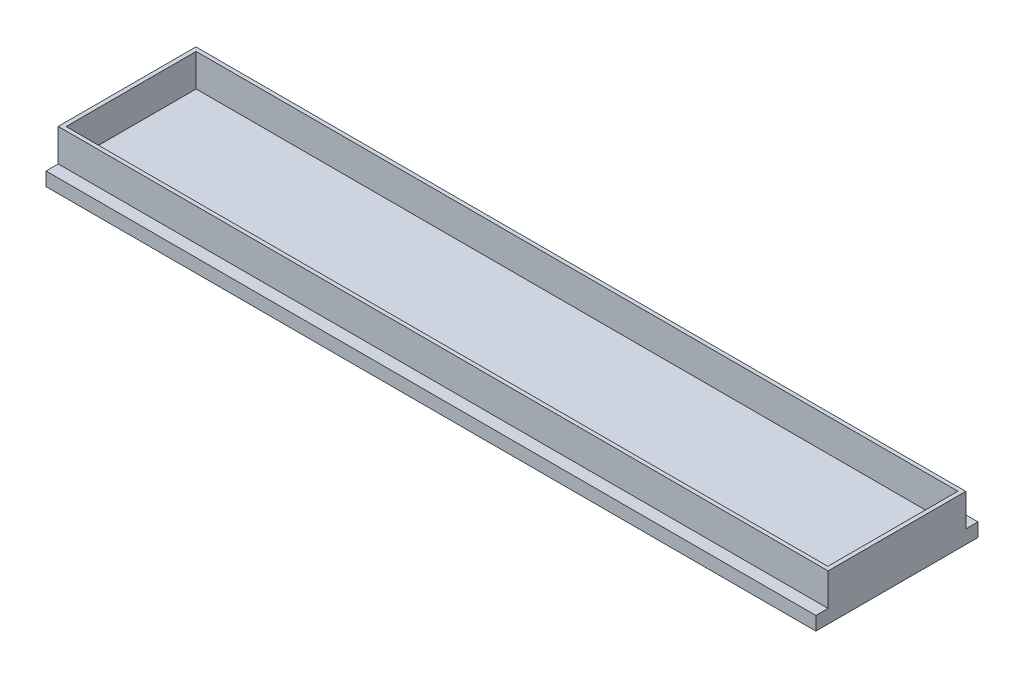
ISO-10303-21;
HEADER;
FILE_DESCRIPTION(('STEP AP214'),'2;1');
FILE_NAME('part.step','',(''),(''),'','','');
FILE_SCHEMA(('AUTOMOTIVE_DESIGN { 1 0 10303 214 1 1 1 1 }'));
ENDSEC;
DATA;
#1=APPLICATION_CONTEXT('core data for automotive mechanical design processes');
#2=APPLICATION_PROTOCOL_DEFINITION('international standard','automotive_design',2000,#1);
#3=PRODUCT_CONTEXT('',#1,'mechanical');
#4=PRODUCT('Part','Part','',(#3));
#5=PRODUCT_RELATED_PRODUCT_CATEGORY('part','',(#4));
#6=PRODUCT_DEFINITION_FORMATION('','',#4);
#7=PRODUCT_DEFINITION_CONTEXT('part definition',#1,'design');
#8=PRODUCT_DEFINITION('design','',#6,#7);
#9=PRODUCT_DEFINITION_SHAPE('','',#8);
#10=(LENGTH_UNIT() NAMED_UNIT(*) SI_UNIT(.MILLI.,.METRE.));
#11=(NAMED_UNIT(*) PLANE_ANGLE_UNIT() SI_UNIT($,.RADIAN.));
#12=(NAMED_UNIT(*) SI_UNIT($,.STERADIAN.) SOLID_ANGLE_UNIT());
#13=UNCERTAINTY_MEASURE_WITH_UNIT(LENGTH_MEASURE(1.E-05),#10,'distance_accuracy_value','');
#14=(GEOMETRIC_REPRESENTATION_CONTEXT(3) GLOBAL_UNCERTAINTY_ASSIGNED_CONTEXT((#13)) GLOBAL_UNIT_ASSIGNED_CONTEXT((#10,
#11,#12)) REPRESENTATION_CONTEXT('',''));
#15=CARTESIAN_POINT('',(0.,0.,0.));
#16=DIRECTION('',(0.,0.,1.));
#17=DIRECTION('',(1.,0.,0.));
#18=AXIS2_PLACEMENT_3D('',#15,#16,#17);
#19=CARTESIAN_POINT('',(0.,25.,0.));
#20=DIRECTION('',(0.,-1.,0.));
#21=DIRECTION('',(0.,0.,-1.));
#22=AXIS2_PLACEMENT_3D('',#19,#20,#21);
#23=PLANE('',#22);
#24=DIRECTION('',(-1.,0.,0.));
#25=VECTOR('',#24,1.);
#26=CARTESIAN_POINT('',(710.,25.,-127.));
#27=LINE('',#26,#25);
#28=CARTESIAN_POINT('',(710.,25.,-127.));
#29=VERTEX_POINT('',#28);
#30=CARTESIAN_POINT('',(-710.,25.,-127.));
#31=VERTEX_POINT('',#30);
#32=EDGE_CURVE('E55',#29,#31,#27,.T.);
#33=ORIENTED_EDGE('',*,*,#32,.F.);
#34=DIRECTION('',(0.,0.,-1.));
#35=VECTOR('',#34,1.);
#36=CARTESIAN_POINT('',(710.,25.,-149.5));
#37=LINE('',#36,#35);
#38=CARTESIAN_POINT('',(710.,25.,-149.5));
#39=VERTEX_POINT('',#38);
#40=EDGE_CURVE('E192',#29,#39,#37,.T.);
#41=ORIENTED_EDGE('',*,*,#40,.T.);
#42=DIRECTION('',(-1.,0.,0.));
#43=VECTOR('',#42,1.);
#44=CARTESIAN_POINT('',(710.,25.,-149.5));
#45=LINE('',#44,#43);
#46=CARTESIAN_POINT('',(-710.,25.,-149.5));
#47=VERTEX_POINT('',#46);
#48=EDGE_CURVE('E195',#39,#47,#45,.T.);
#49=ORIENTED_EDGE('',*,*,#48,.T.);
#50=DIRECTION('',(0.,0.,1.));
#51=VECTOR('',#50,1.);
#52=CARTESIAN_POINT('',(-710.,25.,-149.5));
#53=LINE('',#52,#51);
#54=EDGE_CURVE('E187',#47,#31,#53,.T.);
#55=ORIENTED_EDGE('',*,*,#54,.T.);
#56=EDGE_LOOP('',(#33,#41,#49,#55));
#57=FACE_BOUND('',#56,.T.);
#58=ADVANCED_FACE('F32',(#57),#23,.F.);
#59=DIRECTION('',(1.,0.,0.));
#60=VECTOR('',#59,1.);
#61=CARTESIAN_POINT('',(710.,25.,127.));
#62=LINE('',#61,#60);
#63=CARTESIAN_POINT('',(-710.,25.,127.));
#64=VERTEX_POINT('',#63);
#65=CARTESIAN_POINT('',(710.,25.,127.));
#66=VERTEX_POINT('',#65);
#67=EDGE_CURVE('E139',#64,#66,#62,.T.);
#68=ORIENTED_EDGE('',*,*,#67,.F.);
#69=CARTESIAN_POINT('',(-710.,25.,149.5));
#70=VERTEX_POINT('',#69);
#71=EDGE_CURVE('E190',#64,#70,#53,.T.);
#72=ORIENTED_EDGE('',*,*,#71,.T.);
#73=DIRECTION('',(1.,0.,0.));
#74=VECTOR('',#73,1.);
#75=CARTESIAN_POINT('',(710.,25.,149.5));
#76=LINE('',#75,#74);
#77=CARTESIAN_POINT('',(710.,25.,149.5));
#78=VERTEX_POINT('',#77);
#79=EDGE_CURVE('E189',#70,#78,#76,.T.);
#80=ORIENTED_EDGE('',*,*,#79,.T.);
#81=EDGE_CURVE('E193',#78,#66,#37,.T.);
#82=ORIENTED_EDGE('',*,*,#81,.T.);
#83=EDGE_LOOP('',(#68,#72,#80,#82));
#84=FACE_BOUND('',#83,.T.);
#85=ADVANCED_FACE('F244',(#84),#23,.F.);
#86=CARTESIAN_POINT('',(-710.,25.,-149.5));
#87=DIRECTION('',(1.,0.,0.));
#88=DIRECTION('',(0.,0.,-1.));
#89=AXIS2_PLACEMENT_3D('',#86,#87,#88);
#90=PLANE('',#89);
#91=DIRECTION('',(0.,0.,1.));
#92=VECTOR('',#91,1.);
#93=CARTESIAN_POINT('',(-710.,0.,-149.5));
#94=LINE('',#93,#92);
#95=CARTESIAN_POINT('',(-710.,0.,-149.5));
#96=VERTEX_POINT('',#95);
#97=CARTESIAN_POINT('',(-710.,0.,149.5));
#98=VERTEX_POINT('',#97);
#99=EDGE_CURVE('E186',#96,#98,#94,.T.);
#100=ORIENTED_EDGE('',*,*,#99,.T.);
#101=DIRECTION('',(0.,-1.,0.));
#102=VECTOR('',#101,1.);
#103=CARTESIAN_POINT('',(-710.,25.,149.5));
#104=LINE('',#103,#102);
#105=EDGE_CURVE('E11',#70,#98,#104,.T.);
#106=ORIENTED_EDGE('',*,*,#105,.F.);
#107=ORIENTED_EDGE('',*,*,#71,.F.);
#108=DIRECTION('',(0.,-1.,0.));
#109=VECTOR('',#108,1.);
#110=CARTESIAN_POINT('',(-710.,85.,127.));
#111=LINE('',#110,#109);
#112=CARTESIAN_POINT('',(-710.,85.,127.));
#113=VERTEX_POINT('',#112);
#114=EDGE_CURVE('E183',#113,#64,#111,.T.);
#115=ORIENTED_EDGE('',*,*,#114,.F.);
#116=DIRECTION('',(0.,0.,1.));
#117=VECTOR('',#116,1.);
#118=CARTESIAN_POINT('',(-710.,85.,-127.));
#119=LINE('',#118,#117);
#120=CARTESIAN_POINT('',(-710.,85.,-127.));
#121=VERTEX_POINT('',#120);
#122=EDGE_CURVE('E162',#121,#113,#119,.T.);
#123=ORIENTED_EDGE('',*,*,#122,.F.);
#124=DIRECTION('',(0.,-1.,0.));
#125=VECTOR('',#124,1.);
#126=CARTESIAN_POINT('',(-710.,85.,-127.));
#127=LINE('',#126,#125);
#128=EDGE_CURVE('E171',#121,#31,#127,.T.);
#129=ORIENTED_EDGE('',*,*,#128,.T.);
#130=ORIENTED_EDGE('',*,*,#54,.F.);
#131=DIRECTION('',(0.,-1.,0.));
#132=VECTOR('',#131,1.);
#133=CARTESIAN_POINT('',(-710.,25.,-149.5));
#134=LINE('',#133,#132);
#135=EDGE_CURVE('E197',#47,#96,#134,.T.);
#136=ORIENTED_EDGE('',*,*,#135,.T.);
#137=EDGE_LOOP('',(#100,#106,#107,#115,#123,#129,#130,#136));
#138=FACE_BOUND('',#137,.T.);
#139=ADVANCED_FACE('F34',(#138),#90,.F.);
#140=CARTESIAN_POINT('',(710.,25.,149.5));
#141=DIRECTION('',(0.,0.,-1.));
#142=DIRECTION('',(-1.,0.,0.));
#143=AXIS2_PLACEMENT_3D('',#140,#141,#142);
#144=PLANE('',#143);
#145=DIRECTION('',(1.,0.,0.));
#146=VECTOR('',#145,1.);
#147=CARTESIAN_POINT('',(710.,0.,149.5));
#148=LINE('',#147,#146);
#149=CARTESIAN_POINT('',(710.,0.,149.5));
#150=VERTEX_POINT('',#149);
#151=EDGE_CURVE('E200',#98,#150,#148,.T.);
#152=ORIENTED_EDGE('',*,*,#151,.T.);
#153=DIRECTION('',(0.,-1.,0.));
#154=VECTOR('',#153,1.);
#155=CARTESIAN_POINT('',(710.,25.,149.5));
#156=LINE('',#155,#154);
#157=EDGE_CURVE('E40',#78,#150,#156,.T.);
#158=ORIENTED_EDGE('',*,*,#157,.F.);
#159=ORIENTED_EDGE('',*,*,#79,.F.);
#160=ORIENTED_EDGE('',*,*,#105,.T.);
#161=EDGE_LOOP('',(#152,#158,#159,#160));
#162=FACE_BOUND('',#161,.T.);
#163=ADVANCED_FACE('F245',(#162),#144,.F.);
#164=CARTESIAN_POINT('',(710.,25.,-149.5));
#165=DIRECTION('',(-1.,0.,0.));
#166=DIRECTION('',(0.,0.,1.));
#167=AXIS2_PLACEMENT_3D('',#164,#165,#166);
#168=PLANE('',#167);
#169=DIRECTION('',(0.,0.,-1.));
#170=VECTOR('',#169,1.);
#171=CARTESIAN_POINT('',(710.,0.,-149.5));
#172=LINE('',#171,#170);
#173=CARTESIAN_POINT('',(710.,0.,-149.5));
#174=VERTEX_POINT('',#173);
#175=EDGE_CURVE('E202',#150,#174,#172,.T.);
#176=ORIENTED_EDGE('',*,*,#175,.T.);
#177=DIRECTION('',(0.,-1.,0.));
#178=VECTOR('',#177,1.);
#179=CARTESIAN_POINT('',(710.,25.,-149.5));
#180=LINE('',#179,#178);
#181=EDGE_CURVE('E208',#39,#174,#180,.T.);
#182=ORIENTED_EDGE('',*,*,#181,.F.);
#183=ORIENTED_EDGE('',*,*,#40,.F.);
#184=DIRECTION('',(0.,-1.,0.));
#185=VECTOR('',#184,1.);
#186=CARTESIAN_POINT('',(710.,85.,-127.));
#187=LINE('',#186,#185);
#188=CARTESIAN_POINT('',(710.,85.,-127.));
#189=VERTEX_POINT('',#188);
#190=EDGE_CURVE('E177',#189,#29,#187,.T.);
#191=ORIENTED_EDGE('',*,*,#190,.F.);
#192=DIRECTION('',(0.,0.,-1.));
#193=VECTOR('',#192,1.);
#194=CARTESIAN_POINT('',(710.,85.,-127.));
#195=LINE('',#194,#193);
#196=CARTESIAN_POINT('',(710.,85.,127.));
#197=VERTEX_POINT('',#196);
#198=EDGE_CURVE('E167',#197,#189,#195,.T.);
#199=ORIENTED_EDGE('',*,*,#198,.F.);
#200=DIRECTION('',(0.,-1.,0.));
#201=VECTOR('',#200,1.);
#202=CARTESIAN_POINT('',(710.,85.,127.));
#203=LINE('',#202,#201);
#204=EDGE_CURVE('E180',#197,#66,#203,.T.);
#205=ORIENTED_EDGE('',*,*,#204,.T.);
#206=ORIENTED_EDGE('',*,*,#81,.F.);
#207=ORIENTED_EDGE('',*,*,#157,.T.);
#208=EDGE_LOOP('',(#176,#182,#183,#191,#199,#205,#206,#207));
#209=FACE_BOUND('',#208,.T.);
#210=ADVANCED_FACE('F215',(#209),#168,.F.);
#211=CARTESIAN_POINT('',(710.,25.,-149.5));
#212=DIRECTION('',(0.,0.,1.));
#213=DIRECTION('',(1.,0.,0.));
#214=AXIS2_PLACEMENT_3D('',#211,#212,#213);
#215=PLANE('',#214);
#216=DIRECTION('',(-1.,0.,0.));
#217=VECTOR('',#216,1.);
#218=CARTESIAN_POINT('',(710.,0.,-149.5));
#219=LINE('',#218,#217);
#220=EDGE_CURVE('E204',#174,#96,#219,.T.);
#221=ORIENTED_EDGE('',*,*,#220,.T.);
#222=ORIENTED_EDGE('',*,*,#135,.F.);
#223=ORIENTED_EDGE('',*,*,#48,.F.);
#224=ORIENTED_EDGE('',*,*,#181,.T.);
#225=EDGE_LOOP('',(#221,#222,#223,#224));
#226=FACE_BOUND('',#225,.T.);
#227=ADVANCED_FACE('F225',(#226),#215,.F.);
#228=CARTESIAN_POINT('',(0.,0.,0.));
#229=DIRECTION('',(0.,-1.,0.));
#230=DIRECTION('',(0.,0.,-1.));
#231=AXIS2_PLACEMENT_3D('',#228,#229,#230);
#232=PLANE('',#231);
#233=ORIENTED_EDGE('',*,*,#99,.F.);
#234=ORIENTED_EDGE('',*,*,#220,.F.);
#235=ORIENTED_EDGE('',*,*,#175,.F.);
#236=ORIENTED_EDGE('',*,*,#151,.F.);
#237=EDGE_LOOP('',(#233,#234,#235,#236));
#238=FACE_BOUND('',#237,.T.);
#239=ADVANCED_FACE('F222',(#238),#232,.T.);
#240=CARTESIAN_POINT('',(0.,85.,0.));
#241=DIRECTION('',(0.,-1.,0.));
#242=DIRECTION('',(0.,0.,-1.));
#243=AXIS2_PLACEMENT_3D('',#240,#241,#242);
#244=PLANE('',#243);
#245=ORIENTED_EDGE('',*,*,#122,.T.);
#246=DIRECTION('',(1.,0.,0.));
#247=VECTOR('',#246,1.);
#248=CARTESIAN_POINT('',(710.,85.,127.));
#249=LINE('',#248,#247);
#250=EDGE_CURVE('E165',#113,#197,#249,.T.);
#251=ORIENTED_EDGE('',*,*,#250,.T.);
#252=ORIENTED_EDGE('',*,*,#198,.T.);
#253=DIRECTION('',(-1.,0.,0.));
#254=VECTOR('',#253,1.);
#255=CARTESIAN_POINT('',(710.,85.,-127.));
#256=LINE('',#255,#254);
#257=EDGE_CURVE('E169',#189,#121,#256,.T.);
#258=ORIENTED_EDGE('',*,*,#257,.T.);
#259=EDGE_LOOP('',(#245,#251,#252,#258));
#260=FACE_BOUND('',#259,.T.);
#261=DIRECTION('',(1.,0.,0.));
#262=VECTOR('',#261,1.);
#263=CARTESIAN_POINT('',(702.5,85.,120.));
#264=LINE('',#263,#262);
#265=CARTESIAN_POINT('',(-702.5,85.,120.));
#266=VERTEX_POINT('',#265);
#267=CARTESIAN_POINT('',(702.5,85.,120.));
#268=VERTEX_POINT('',#267);
#269=EDGE_CURVE('E123',#266,#268,#264,.T.);
#270=ORIENTED_EDGE('',*,*,#269,.F.);
#271=DIRECTION('',(0.,0.,1.));
#272=VECTOR('',#271,1.);
#273=CARTESIAN_POINT('',(-702.5,85.,120.));
#274=LINE('',#273,#272);
#275=CARTESIAN_POINT('',(-702.5,85.,-120.));
#276=VERTEX_POINT('',#275);
#277=EDGE_CURVE('E147',#276,#266,#274,.T.);
#278=ORIENTED_EDGE('',*,*,#277,.F.);
#279=DIRECTION('',(-1.,0.,0.));
#280=VECTOR('',#279,1.);
#281=CARTESIAN_POINT('',(702.5,85.,-120.));
#282=LINE('',#281,#280);
#283=CARTESIAN_POINT('',(702.5,85.,-120.));
#284=VERTEX_POINT('',#283);
#285=EDGE_CURVE('E145',#284,#276,#282,.T.);
#286=ORIENTED_EDGE('',*,*,#285,.F.);
#287=DIRECTION('',(0.,0.,-1.));
#288=VECTOR('',#287,1.);
#289=CARTESIAN_POINT('',(702.5,85.,120.));
#290=LINE('',#289,#288);
#291=EDGE_CURVE('E132',#268,#284,#290,.T.);
#292=ORIENTED_EDGE('',*,*,#291,.F.);
#293=EDGE_LOOP('',(#270,#278,#286,#292));
#294=FACE_BOUND('',#293,.T.);
#295=ADVANCED_FACE('F143',(#260,#294),#244,.F.);
#296=CARTESIAN_POINT('',(710.,85.,127.));
#297=DIRECTION('',(0.,0.,-1.));
#298=DIRECTION('',(-1.,0.,0.));
#299=AXIS2_PLACEMENT_3D('',#296,#297,#298);
#300=PLANE('',#299);
#301=ORIENTED_EDGE('',*,*,#67,.T.);
#302=ORIENTED_EDGE('',*,*,#204,.F.);
#303=ORIENTED_EDGE('',*,*,#250,.F.);
#304=ORIENTED_EDGE('',*,*,#114,.T.);
#305=EDGE_LOOP('',(#301,#302,#303,#304));
#306=FACE_BOUND('',#305,.T.);
#307=ADVANCED_FACE('F241',(#306),#300,.F.);
#308=CARTESIAN_POINT('',(710.,85.,-127.));
#309=DIRECTION('',(0.,0.,1.));
#310=DIRECTION('',(1.,0.,0.));
#311=AXIS2_PLACEMENT_3D('',#308,#309,#310);
#312=PLANE('',#311);
#313=ORIENTED_EDGE('',*,*,#32,.T.);
#314=ORIENTED_EDGE('',*,*,#128,.F.);
#315=ORIENTED_EDGE('',*,*,#257,.F.);
#316=ORIENTED_EDGE('',*,*,#190,.T.);
#317=EDGE_LOOP('',(#313,#314,#315,#316));
#318=FACE_BOUND('',#317,.T.);
#319=ADVANCED_FACE('F233',(#318),#312,.F.);
#320=CARTESIAN_POINT('',(702.5,85.,120.));
#321=DIRECTION('',(0.,0.,-1.));
#322=DIRECTION('',(-1.,0.,0.));
#323=AXIS2_PLACEMENT_3D('',#320,#321,#322);
#324=PLANE('',#323);
#325=DIRECTION('',(1.,0.,0.));
#326=VECTOR('',#325,1.);
#327=CARTESIAN_POINT('',(702.5,25.,120.));
#328=LINE('',#327,#326);
#329=CARTESIAN_POINT('',(-702.5,25.,120.));
#330=VERTEX_POINT('',#329);
#331=CARTESIAN_POINT('',(702.5,25.,120.));
#332=VERTEX_POINT('',#331);
#333=EDGE_CURVE('E151',#330,#332,#328,.T.);
#334=ORIENTED_EDGE('',*,*,#333,.F.);
#335=DIRECTION('',(0.,-1.,0.));
#336=VECTOR('',#335,1.);
#337=CARTESIAN_POINT('',(-702.5,85.,120.));
#338=LINE('',#337,#336);
#339=EDGE_CURVE('E128',#266,#330,#338,.T.);
#340=ORIENTED_EDGE('',*,*,#339,.F.);
#341=ORIENTED_EDGE('',*,*,#269,.T.);
#342=DIRECTION('',(0.,-1.,0.));
#343=VECTOR('',#342,1.);
#344=CARTESIAN_POINT('',(702.5,85.,120.));
#345=LINE('',#344,#343);
#346=EDGE_CURVE('E126',#268,#332,#345,.T.);
#347=ORIENTED_EDGE('',*,*,#346,.T.);
#348=EDGE_LOOP('',(#334,#340,#341,#347));
#349=FACE_BOUND('',#348,.T.);
#350=ADVANCED_FACE('F125',(#349),#324,.T.);
#351=CARTESIAN_POINT('',(702.5,85.,120.));
#352=DIRECTION('',(-1.,0.,0.));
#353=DIRECTION('',(0.,0.,1.));
#354=AXIS2_PLACEMENT_3D('',#351,#352,#353);
#355=PLANE('',#354);
#356=DIRECTION('',(0.,0.,-1.));
#357=VECTOR('',#356,1.);
#358=CARTESIAN_POINT('',(702.5,25.,120.));
#359=LINE('',#358,#357);
#360=CARTESIAN_POINT('',(702.5,25.,-120.));
#361=VERTEX_POINT('',#360);
#362=EDGE_CURVE('E138',#332,#361,#359,.T.);
#363=ORIENTED_EDGE('',*,*,#362,.F.);
#364=ORIENTED_EDGE('',*,*,#346,.F.);
#365=ORIENTED_EDGE('',*,*,#291,.T.);
#366=DIRECTION('',(0.,-1.,0.));
#367=VECTOR('',#366,1.);
#368=CARTESIAN_POINT('',(702.5,85.,-120.));
#369=LINE('',#368,#367);
#370=EDGE_CURVE('E140',#284,#361,#369,.T.);
#371=ORIENTED_EDGE('',*,*,#370,.T.);
#372=EDGE_LOOP('',(#363,#364,#365,#371));
#373=FACE_BOUND('',#372,.T.);
#374=ADVANCED_FACE('F135',(#373),#355,.T.);
#375=CARTESIAN_POINT('',(702.5,85.,-120.));
#376=DIRECTION('',(0.,0.,1.));
#377=DIRECTION('',(1.,0.,0.));
#378=AXIS2_PLACEMENT_3D('',#375,#376,#377);
#379=PLANE('',#378);
#380=DIRECTION('',(-1.,0.,0.));
#381=VECTOR('',#380,1.);
#382=CARTESIAN_POINT('',(702.5,25.,-120.));
#383=LINE('',#382,#381);
#384=CARTESIAN_POINT('',(-702.5,25.,-120.));
#385=VERTEX_POINT('',#384);
#386=EDGE_CURVE('E154',#361,#385,#383,.T.);
#387=ORIENTED_EDGE('',*,*,#386,.F.);
#388=ORIENTED_EDGE('',*,*,#370,.F.);
#389=ORIENTED_EDGE('',*,*,#285,.T.);
#390=DIRECTION('',(0.,-1.,0.));
#391=VECTOR('',#390,1.);
#392=CARTESIAN_POINT('',(-702.5,85.,-120.));
#393=LINE('',#392,#391);
#394=EDGE_CURVE('E159',#276,#385,#393,.T.);
#395=ORIENTED_EDGE('',*,*,#394,.T.);
#396=EDGE_LOOP('',(#387,#388,#389,#395));
#397=FACE_BOUND('',#396,.T.);
#398=ADVANCED_FACE('F266',(#397),#379,.T.);
#399=CARTESIAN_POINT('',(-702.5,85.,120.));
#400=DIRECTION('',(1.,0.,0.));
#401=DIRECTION('',(0.,0.,-1.));
#402=AXIS2_PLACEMENT_3D('',#399,#400,#401);
#403=PLANE('',#402);
#404=DIRECTION('',(0.,0.,1.));
#405=VECTOR('',#404,1.);
#406=CARTESIAN_POINT('',(-702.5,25.,120.));
#407=LINE('',#406,#405);
#408=EDGE_CURVE('E47',#385,#330,#407,.T.);
#409=ORIENTED_EDGE('',*,*,#408,.F.);
#410=ORIENTED_EDGE('',*,*,#394,.F.);
#411=ORIENTED_EDGE('',*,*,#277,.T.);
#412=ORIENTED_EDGE('',*,*,#339,.T.);
#413=EDGE_LOOP('',(#409,#410,#411,#412));
#414=FACE_BOUND('',#413,.T.);
#415=ADVANCED_FACE('F261',(#414),#403,.T.);
#416=ORIENTED_EDGE('',*,*,#386,.T.);
#417=ORIENTED_EDGE('',*,*,#408,.T.);
#418=ORIENTED_EDGE('',*,*,#333,.T.);
#419=ORIENTED_EDGE('',*,*,#362,.T.);
#420=EDGE_LOOP('',(#416,#417,#418,#419));
#421=FACE_BOUND('',#420,.T.);
#422=ADVANCED_FACE('F254',(#421),#23,.F.);
#423=CLOSED_SHELL('',(#58,#85,#139,#163,#210,#227,#239,#295,#307,#319,#350,#374,#398,#415,#422));
#424=MANIFOLD_SOLID_BREP('B2',#423);
#425=ADVANCED_BREP_SHAPE_REPRESENTATION('',(#18,#424),#14);
#426=SHAPE_DEFINITION_REPRESENTATION(#9,#425);
ENDSEC;
END-ISO-10303-21;
